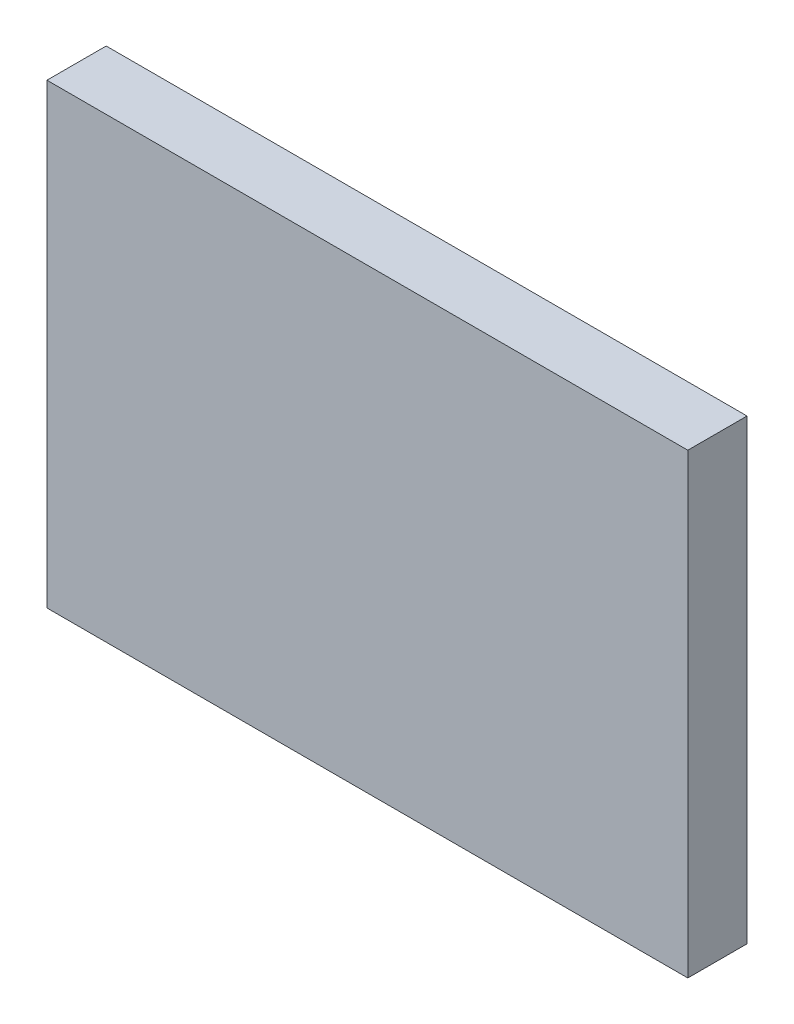
ISO-10303-21;
HEADER;
FILE_DESCRIPTION(('STEP AP214'),'2;1');
FILE_NAME('part.step','',(''),(''),'','','');
FILE_SCHEMA(('AUTOMOTIVE_DESIGN { 1 0 10303 214 1 1 1 1 }'));
ENDSEC;
DATA;
#1=APPLICATION_CONTEXT('core data for automotive mechanical design processes');
#2=APPLICATION_PROTOCOL_DEFINITION('international standard','automotive_design',2000,#1);
#3=PRODUCT_CONTEXT('',#1,'mechanical');
#4=PRODUCT('Part','Part','',(#3));
#5=PRODUCT_RELATED_PRODUCT_CATEGORY('part','',(#4));
#6=PRODUCT_DEFINITION_FORMATION('','',#4);
#7=PRODUCT_DEFINITION_CONTEXT('part definition',#1,'design');
#8=PRODUCT_DEFINITION('design','',#6,#7);
#9=PRODUCT_DEFINITION_SHAPE('','',#8);
#10=(LENGTH_UNIT() NAMED_UNIT(*) SI_UNIT(.MILLI.,.METRE.));
#11=(NAMED_UNIT(*) PLANE_ANGLE_UNIT() SI_UNIT($,.RADIAN.));
#12=(NAMED_UNIT(*) SI_UNIT($,.STERADIAN.) SOLID_ANGLE_UNIT());
#13=UNCERTAINTY_MEASURE_WITH_UNIT(LENGTH_MEASURE(1.E-05),#10,'distance_accuracy_value','');
#14=(GEOMETRIC_REPRESENTATION_CONTEXT(3) GLOBAL_UNCERTAINTY_ASSIGNED_CONTEXT((#13)) GLOBAL_UNIT_ASSIGNED_CONTEXT((#10,
#11,#12)) REPRESENTATION_CONTEXT('',''));
#15=CARTESIAN_POINT('',(0.,0.,0.));
#16=DIRECTION('',(0.,0.,1.));
#17=DIRECTION('',(1.,0.,0.));
#18=AXIS2_PLACEMENT_3D('',#15,#16,#17);
#19=CARTESIAN_POINT('',(0.,0.,6.35));
#20=DIRECTION('',(-1.,0.,0.));
#21=DIRECTION('',(0.,-1.,0.));
#22=AXIS2_PLACEMENT_3D('',#19,#20,#21);
#23=PLANE('',#22);
#24=DIRECTION('',(0.,0.,1.));
#25=VECTOR('',#24,1.);
#26=CARTESIAN_POINT('',(0.,6.35,0.));
#27=LINE('',#26,#25);
#28=CARTESIAN_POINT('',(0.,6.35,0.));
#29=VERTEX_POINT('',#28);
#30=CARTESIAN_POINT('',(0.,6.35,6.35));
#31=VERTEX_POINT('',#30);
#32=EDGE_CURVE('E110',#29,#31,#27,.T.);
#33=ORIENTED_EDGE('',*,*,#32,.F.);
#34=DIRECTION('',(0.,1.,0.));
#35=VECTOR('',#34,1.);
#36=CARTESIAN_POINT('',(0.,0.,0.));
#37=LINE('',#36,#35);
#38=CARTESIAN_POINT('',(0.,55.35,0.));
#39=VERTEX_POINT('',#38);
#40=EDGE_CURVE('E86',#29,#39,#37,.T.);
#41=ORIENTED_EDGE('',*,*,#40,.T.);
#42=DIRECTION('',(0.,0.,-1.));
#43=VECTOR('',#42,1.);
#44=CARTESIAN_POINT('',(0.,55.35,6.35));
#45=LINE('',#44,#43);
#46=CARTESIAN_POINT('',(0.,55.35,6.35));
#47=VERTEX_POINT('',#46);
#48=EDGE_CURVE('E11',#47,#39,#45,.T.);
#49=ORIENTED_EDGE('',*,*,#48,.F.);
#50=DIRECTION('',(0.,1.,0.));
#51=VECTOR('',#50,1.);
#52=CARTESIAN_POINT('',(0.,0.,6.35));
#53=LINE('',#52,#51);
#54=EDGE_CURVE('E96',#31,#47,#53,.T.);
#55=ORIENTED_EDGE('',*,*,#54,.F.);
#56=EDGE_LOOP('',(#33,#41,#49,#55));
#57=FACE_BOUND('',#56,.T.);
#58=ADVANCED_FACE('F40',(#57),#23,.F.);
#59=CARTESIAN_POINT('',(-68.7,0.,6.35));
#60=DIRECTION('',(1.,0.,0.));
#61=DIRECTION('',(0.,0.,-1.));
#62=AXIS2_PLACEMENT_3D('',#59,#60,#61);
#63=PLANE('',#62);
#64=DIRECTION('',(0.,0.,-1.));
#65=VECTOR('',#64,1.);
#66=CARTESIAN_POINT('',(-68.7,6.35,6.35));
#67=LINE('',#66,#65);
#68=CARTESIAN_POINT('',(-68.7,6.35,6.35));
#69=VERTEX_POINT('',#68);
#70=CARTESIAN_POINT('',(-68.7,6.35,0.));
#71=VERTEX_POINT('',#70);
#72=EDGE_CURVE('E55',#69,#71,#67,.T.);
#73=ORIENTED_EDGE('',*,*,#72,.F.);
#74=DIRECTION('',(0.,-1.,0.));
#75=VECTOR('',#74,1.);
#76=CARTESIAN_POINT('',(-68.7,0.,6.35));
#77=LINE('',#76,#75);
#78=CARTESIAN_POINT('',(-68.7,55.35,6.35));
#79=VERTEX_POINT('',#78);
#80=EDGE_CURVE('E91',#79,#69,#77,.T.);
#81=ORIENTED_EDGE('',*,*,#80,.F.);
#82=DIRECTION('',(0.,0.,-1.));
#83=VECTOR('',#82,1.);
#84=CARTESIAN_POINT('',(-68.7,55.35,6.35));
#85=LINE('',#84,#83);
#86=CARTESIAN_POINT('',(-68.7,55.35,0.));
#87=VERTEX_POINT('',#86);
#88=EDGE_CURVE('E48',#79,#87,#85,.T.);
#89=ORIENTED_EDGE('',*,*,#88,.T.);
#90=DIRECTION('',(0.,-1.,0.));
#91=VECTOR('',#90,1.);
#92=CARTESIAN_POINT('',(-68.7,0.,0.));
#93=LINE('',#92,#91);
#94=EDGE_CURVE('E85',#87,#71,#93,.T.);
#95=ORIENTED_EDGE('',*,*,#94,.T.);
#96=EDGE_LOOP('',(#73,#81,#89,#95));
#97=FACE_BOUND('',#96,.T.);
#98=ADVANCED_FACE('F90',(#97),#63,.F.);
#99=CARTESIAN_POINT('',(0.,0.,6.35));
#100=DIRECTION('',(0.,0.,1.));
#101=DIRECTION('',(1.,0.,0.));
#102=AXIS2_PLACEMENT_3D('',#99,#100,#101);
#103=PLANE('',#102);
#104=ORIENTED_EDGE('',*,*,#80,.T.);
#105=DIRECTION('',(-1.,0.,0.));
#106=VECTOR('',#105,1.);
#107=CARTESIAN_POINT('',(0.,6.35,6.35));
#108=LINE('',#107,#106);
#109=EDGE_CURVE('E103',#31,#69,#108,.T.);
#110=ORIENTED_EDGE('',*,*,#109,.F.);
#111=ORIENTED_EDGE('',*,*,#54,.T.);
#112=DIRECTION('',(-1.,0.,0.));
#113=VECTOR('',#112,1.);
#114=CARTESIAN_POINT('',(0.,55.35,6.35));
#115=LINE('',#114,#113);
#116=EDGE_CURVE('E64',#47,#79,#115,.T.);
#117=ORIENTED_EDGE('',*,*,#116,.T.);
#118=EDGE_LOOP('',(#104,#110,#111,#117));
#119=FACE_BOUND('',#118,.T.);
#120=ADVANCED_FACE('F126',(#119),#103,.T.);
#121=CARTESIAN_POINT('',(0.,0.,0.));
#122=DIRECTION('',(0.,0.,1.));
#123=DIRECTION('',(1.,0.,0.));
#124=AXIS2_PLACEMENT_3D('',#121,#122,#123);
#125=PLANE('',#124);
#126=DIRECTION('',(1.,0.,0.));
#127=VECTOR('',#126,1.);
#128=CARTESIAN_POINT('',(-68.7,6.35,0.));
#129=LINE('',#128,#127);
#130=EDGE_CURVE('E94',#71,#29,#129,.T.);
#131=ORIENTED_EDGE('',*,*,#130,.F.);
#132=ORIENTED_EDGE('',*,*,#94,.F.);
#133=DIRECTION('',(-1.,0.,0.));
#134=VECTOR('',#133,1.);
#135=CARTESIAN_POINT('',(0.,55.35,0.));
#136=LINE('',#135,#134);
#137=EDGE_CURVE('E76',#39,#87,#136,.T.);
#138=ORIENTED_EDGE('',*,*,#137,.F.);
#139=ORIENTED_EDGE('',*,*,#40,.F.);
#140=EDGE_LOOP('',(#131,#132,#138,#139));
#141=FACE_BOUND('',#140,.T.);
#142=ADVANCED_FACE('F93',(#141),#125,.F.);
#143=CARTESIAN_POINT('',(0.,55.35,6.35));
#144=DIRECTION('',(0.,-1.,0.));
#145=DIRECTION('',(0.,0.,-1.));
#146=AXIS2_PLACEMENT_3D('',#143,#144,#145);
#147=PLANE('',#146);
#148=ORIENTED_EDGE('',*,*,#137,.T.);
#149=ORIENTED_EDGE('',*,*,#88,.F.);
#150=ORIENTED_EDGE('',*,*,#116,.F.);
#151=ORIENTED_EDGE('',*,*,#48,.T.);
#152=EDGE_LOOP('',(#148,#149,#150,#151));
#153=FACE_BOUND('',#152,.T.);
#154=ADVANCED_FACE('F78',(#153),#147,.F.);
#155=CARTESIAN_POINT('',(0.,6.35,0.));
#156=DIRECTION('',(0.,-1.,0.));
#157=DIRECTION('',(1.,0.,0.));
#158=AXIS2_PLACEMENT_3D('',#155,#156,#157);
#159=PLANE('',#158);
#160=ORIENTED_EDGE('',*,*,#72,.T.);
#161=ORIENTED_EDGE('',*,*,#130,.T.);
#162=ORIENTED_EDGE('',*,*,#32,.T.);
#163=ORIENTED_EDGE('',*,*,#109,.T.);
#164=EDGE_LOOP('',(#160,#161,#162,#163));
#165=FACE_BOUND('',#164,.T.);
#166=ADVANCED_FACE('F119',(#165),#159,.T.);
#167=CLOSED_SHELL('',(#58,#98,#120,#142,#154,#166));
#168=MANIFOLD_SOLID_BREP('B2',#167);
#169=ADVANCED_BREP_SHAPE_REPRESENTATION('',(#18,#168),#14);
#170=SHAPE_DEFINITION_REPRESENTATION(#9,#169);
ENDSEC;
END-ISO-10303-21;
